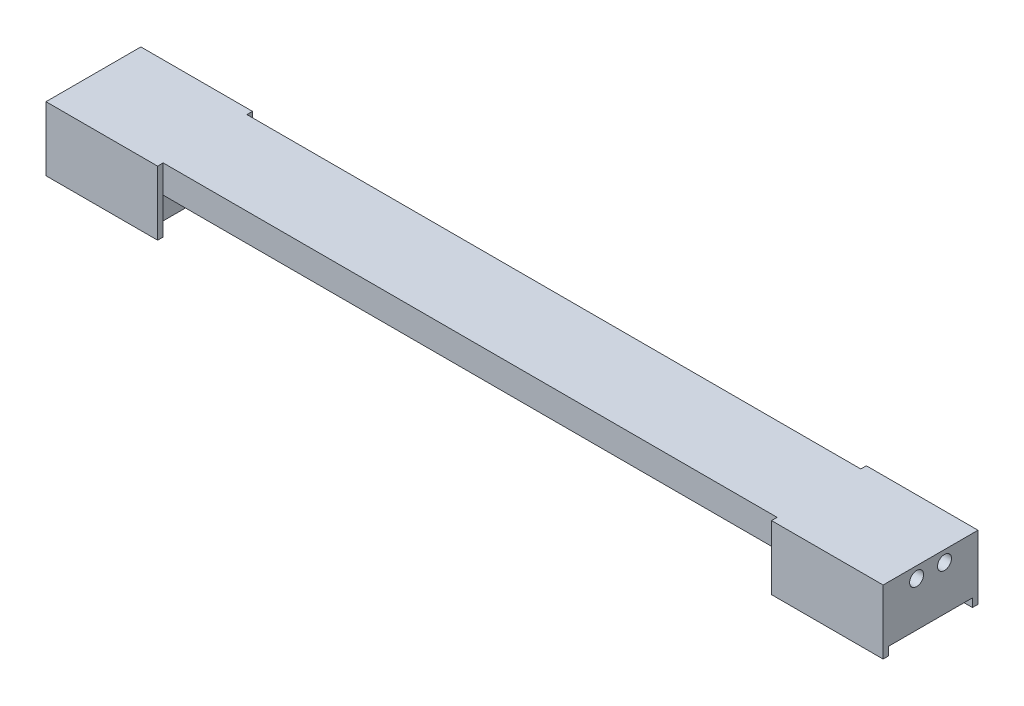
ISO-10303-21;
HEADER;
FILE_DESCRIPTION(('STEP AP214'),'2;1');
FILE_NAME('part.step','',(''),(''),'','','');
FILE_SCHEMA(('AUTOMOTIVE_DESIGN { 1 0 10303 214 1 1 1 1 }'));
ENDSEC;
DATA;
#1=APPLICATION_CONTEXT('core data for automotive mechanical design processes');
#2=APPLICATION_PROTOCOL_DEFINITION('international standard','automotive_design',2000,#1);
#3=PRODUCT_CONTEXT('',#1,'mechanical');
#4=PRODUCT('Part','Part','',(#3));
#5=PRODUCT_RELATED_PRODUCT_CATEGORY('part','',(#4));
#6=PRODUCT_DEFINITION_FORMATION('','',#4);
#7=PRODUCT_DEFINITION_CONTEXT('part definition',#1,'design');
#8=PRODUCT_DEFINITION('design','',#6,#7);
#9=PRODUCT_DEFINITION_SHAPE('','',#8);
#10=(LENGTH_UNIT() NAMED_UNIT(*) SI_UNIT(.MILLI.,.METRE.));
#11=(NAMED_UNIT(*) PLANE_ANGLE_UNIT() SI_UNIT($,.RADIAN.));
#12=(NAMED_UNIT(*) SI_UNIT($,.STERADIAN.) SOLID_ANGLE_UNIT());
#13=UNCERTAINTY_MEASURE_WITH_UNIT(LENGTH_MEASURE(1.E-05),#10,'distance_accuracy_value','');
#14=(GEOMETRIC_REPRESENTATION_CONTEXT(3) GLOBAL_UNCERTAINTY_ASSIGNED_CONTEXT((#13)) GLOBAL_UNIT_ASSIGNED_CONTEXT((#10,
#11,#12)) REPRESENTATION_CONTEXT('',''));
#15=CARTESIAN_POINT('',(0.,0.,0.));
#16=DIRECTION('',(0.,0.,1.));
#17=DIRECTION('',(1.,0.,0.));
#18=AXIS2_PLACEMENT_3D('',#15,#16,#17);
#19=CARTESIAN_POINT('',(0.,-11.5,0.));
#20=DIRECTION('',(0.,-1.,0.));
#21=DIRECTION('',(1.,0.,0.));
#22=AXIS2_PLACEMENT_3D('',#19,#20,#21);
#23=PLANE('',#22);
#24=DIRECTION('',(0.,0.,1.));
#25=VECTOR('',#24,1.);
#26=CARTESIAN_POINT('',(75.,-11.5,-1.));
#27=LINE('',#26,#25);
#28=CARTESIAN_POINT('',(75.,-11.5,-1.));
#29=VERTEX_POINT('',#28);
#30=CARTESIAN_POINT('',(75.,-11.5,0.));
#31=VERTEX_POINT('',#30);
#32=EDGE_CURVE('E294',#29,#31,#27,.T.);
#33=ORIENTED_EDGE('',*,*,#32,.T.);
#34=DIRECTION('',(-1.,0.,0.));
#35=VECTOR('',#34,1.);
#36=CARTESIAN_POINT('',(56.,-11.5,0.));
#37=LINE('',#36,#35);
#38=CARTESIAN_POINT('',(55.,-11.5,0.));
#39=VERTEX_POINT('',#38);
#40=EDGE_CURVE('E270',#31,#39,#37,.T.);
#41=ORIENTED_EDGE('',*,*,#40,.T.);
#42=DIRECTION('',(0.,0.,-1.));
#43=VECTOR('',#42,1.);
#44=CARTESIAN_POINT('',(55.,-11.5,0.));
#45=LINE('',#44,#43);
#46=CARTESIAN_POINT('',(55.,-11.5,-1.));
#47=VERTEX_POINT('',#46);
#48=EDGE_CURVE('E288',#39,#47,#45,.T.);
#49=ORIENTED_EDGE('',*,*,#48,.T.);
#50=DIRECTION('',(1.,0.,0.));
#51=VECTOR('',#50,1.);
#52=CARTESIAN_POINT('',(56.,-11.5,-1.));
#53=LINE('',#52,#51);
#54=EDGE_CURVE('E291',#47,#29,#53,.T.);
#55=ORIENTED_EDGE('',*,*,#54,.T.);
#56=EDGE_LOOP('',(#33,#41,#49,#55));
#57=FACE_BOUND('',#56,.T.);
#58=ADVANCED_FACE('F33',(#57),#23,.T.);
#59=CARTESIAN_POINT('',(0.,-11.5,0.));
#60=DIRECTION('',(0.,-1.,0.));
#61=DIRECTION('',(-1.,0.,0.));
#62=AXIS2_PLACEMENT_3D('',#59,#60,#61);
#63=PLANE('',#62);
#64=DIRECTION('',(1.,0.,0.));
#65=VECTOR('',#64,1.);
#66=CARTESIAN_POINT('',(-56.,-11.5,0.));
#67=LINE('',#66,#65);
#68=CARTESIAN_POINT('',(-75.,-11.5,0.));
#69=VERTEX_POINT('',#68);
#70=CARTESIAN_POINT('',(-55.,-11.5,0.));
#71=VERTEX_POINT('',#70);
#72=EDGE_CURVE('E231',#69,#71,#67,.T.);
#73=ORIENTED_EDGE('',*,*,#72,.F.);
#74=DIRECTION('',(0.,0.,1.));
#75=VECTOR('',#74,1.);
#76=CARTESIAN_POINT('',(-75.,-11.5,-1.));
#77=LINE('',#76,#75);
#78=CARTESIAN_POINT('',(-75.,-11.5,-1.));
#79=VERTEX_POINT('',#78);
#80=EDGE_CURVE('E245',#79,#69,#77,.T.);
#81=ORIENTED_EDGE('',*,*,#80,.F.);
#82=DIRECTION('',(-1.,0.,0.));
#83=VECTOR('',#82,1.);
#84=CARTESIAN_POINT('',(-56.,-11.5,-1.));
#85=LINE('',#84,#83);
#86=CARTESIAN_POINT('',(-55.,-11.5,-1.));
#87=VERTEX_POINT('',#86);
#88=EDGE_CURVE('E248',#87,#79,#85,.T.);
#89=ORIENTED_EDGE('',*,*,#88,.F.);
#90=DIRECTION('',(0.,0.,-1.));
#91=VECTOR('',#90,1.);
#92=CARTESIAN_POINT('',(-55.,-11.5,0.));
#93=LINE('',#92,#91);
#94=EDGE_CURVE('E251',#71,#87,#93,.T.);
#95=ORIENTED_EDGE('',*,*,#94,.F.);
#96=EDGE_LOOP('',(#73,#81,#89,#95));
#97=FACE_BOUND('',#96,.T.);
#98=ADVANCED_FACE('F412',(#97),#63,.T.);
#99=CARTESIAN_POINT('',(0.,0.,15.));
#100=DIRECTION('',(0.,0.,1.));
#101=DIRECTION('',(1.,0.,0.));
#102=AXIS2_PLACEMENT_3D('',#99,#100,#101);
#103=PLANE('',#102);
#104=DIRECTION('',(-1.,0.,0.));
#105=VECTOR('',#104,1.);
#106=CARTESIAN_POINT('',(-74.,0.,15.));
#107=LINE('',#106,#105);
#108=CARTESIAN_POINT('',(55.,0.,15.));
#109=VERTEX_POINT('',#108);
#110=CARTESIAN_POINT('',(-55.,0.,15.));
#111=VERTEX_POINT('',#110);
#112=EDGE_CURVE('E194',#109,#111,#107,.T.);
#113=ORIENTED_EDGE('',*,*,#112,.T.);
#114=DIRECTION('',(0.,-1.,0.));
#115=VECTOR('',#114,1.);
#116=CARTESIAN_POINT('',(-55.,26.2488094968134,15.));
#117=LINE('',#116,#115);
#118=CARTESIAN_POINT('',(-55.,-5.,15.));
#119=VERTEX_POINT('',#118);
#120=EDGE_CURVE('E283',#111,#119,#117,.T.);
#121=ORIENTED_EDGE('',*,*,#120,.T.);
#122=DIRECTION('',(1.,0.,0.));
#123=VECTOR('',#122,1.);
#124=CARTESIAN_POINT('',(-56.,-5.,15.));
#125=LINE('',#124,#123);
#126=CARTESIAN_POINT('',(55.,-5.,15.));
#127=VERTEX_POINT('',#126);
#128=EDGE_CURVE('E340',#119,#127,#125,.T.);
#129=ORIENTED_EDGE('',*,*,#128,.T.);
#130=DIRECTION('',(0.,-1.,0.));
#131=VECTOR('',#130,1.);
#132=CARTESIAN_POINT('',(55.,26.2488094968134,15.));
#133=LINE('',#132,#131);
#134=EDGE_CURVE('E307',#109,#127,#133,.T.);
#135=ORIENTED_EDGE('',*,*,#134,.F.);
#136=EDGE_LOOP('',(#113,#121,#129,#135));
#137=FACE_BOUND('',#136,.T.);
#138=ADVANCED_FACE('F390',(#137),#103,.T.);
#139=CARTESIAN_POINT('',(0.,0.,0.));
#140=DIRECTION('',(0.,0.,1.));
#141=DIRECTION('',(1.,0.,0.));
#142=AXIS2_PLACEMENT_3D('',#139,#140,#141);
#143=PLANE('',#142);
#144=DIRECTION('',(0.,-1.,0.));
#145=VECTOR('',#144,1.);
#146=CARTESIAN_POINT('',(-55.,26.2488094968134,0.));
#147=LINE('',#146,#145);
#148=CARTESIAN_POINT('',(-55.,0.,0.));
#149=VERTEX_POINT('',#148);
#150=CARTESIAN_POINT('',(-55.,-5.,0.));
#151=VERTEX_POINT('',#150);
#152=EDGE_CURVE('E259',#149,#151,#147,.T.);
#153=ORIENTED_EDGE('',*,*,#152,.F.);
#154=DIRECTION('',(-1.,0.,0.));
#155=VECTOR('',#154,1.);
#156=CARTESIAN_POINT('',(-74.,0.,0.));
#157=LINE('',#156,#155);
#158=CARTESIAN_POINT('',(55.,0.,0.));
#159=VERTEX_POINT('',#158);
#160=EDGE_CURVE('E344',#159,#149,#157,.T.);
#161=ORIENTED_EDGE('',*,*,#160,.F.);
#162=DIRECTION('',(0.,-1.,0.));
#163=VECTOR('',#162,1.);
#164=CARTESIAN_POINT('',(55.,26.2488094968134,0.));
#165=LINE('',#164,#163);
#166=CARTESIAN_POINT('',(55.,-5.,0.));
#167=VERTEX_POINT('',#166);
#168=EDGE_CURVE('E56',#159,#167,#165,.T.);
#169=ORIENTED_EDGE('',*,*,#168,.T.);
#170=DIRECTION('',(1.,0.,0.));
#171=VECTOR('',#170,1.);
#172=CARTESIAN_POINT('',(-56.,-5.,0.));
#173=LINE('',#172,#171);
#174=EDGE_CURVE('E356',#151,#167,#173,.T.);
#175=ORIENTED_EDGE('',*,*,#174,.F.);
#176=EDGE_LOOP('',(#153,#161,#169,#175));
#177=FACE_BOUND('',#176,.T.);
#178=ADVANCED_FACE('F422',(#177),#143,.F.);
#179=CARTESIAN_POINT('',(56.,-5.,15.));
#180=DIRECTION('',(1.,0.,0.));
#181=DIRECTION('',(0.,1.,0.));
#182=AXIS2_PLACEMENT_3D('',#179,#180,#181);
#183=PLANE('',#182);
#184=DIRECTION('',(0.,-1.,0.));
#185=VECTOR('',#184,1.);
#186=CARTESIAN_POINT('',(56.,-5.,0.));
#187=LINE('',#186,#185);
#188=CARTESIAN_POINT('',(56.,-5.,0.));
#189=VERTEX_POINT('',#188);
#190=CARTESIAN_POINT('',(56.,-10.,0.));
#191=VERTEX_POINT('',#190);
#192=EDGE_CURVE('E315',#189,#191,#187,.T.);
#193=ORIENTED_EDGE('',*,*,#192,.T.);
#194=DIRECTION('',(0.,0.,-1.));
#195=VECTOR('',#194,1.);
#196=CARTESIAN_POINT('',(56.,-10.,15.));
#197=LINE('',#196,#195);
#198=CARTESIAN_POINT('',(56.,-10.,15.));
#199=VERTEX_POINT('',#198);
#200=EDGE_CURVE('E11',#199,#191,#197,.T.);
#201=ORIENTED_EDGE('',*,*,#200,.F.);
#202=DIRECTION('',(0.,-1.,0.));
#203=VECTOR('',#202,1.);
#204=CARTESIAN_POINT('',(56.,-5.,15.));
#205=LINE('',#204,#203);
#206=CARTESIAN_POINT('',(56.,-5.,15.));
#207=VERTEX_POINT('',#206);
#208=EDGE_CURVE('E191',#207,#199,#205,.T.);
#209=ORIENTED_EDGE('',*,*,#208,.F.);
#210=DIRECTION('',(0.,0.,-1.));
#211=VECTOR('',#210,1.);
#212=CARTESIAN_POINT('',(56.,-5.,15.));
#213=LINE('',#212,#211);
#214=EDGE_CURVE('E339',#207,#189,#213,.T.);
#215=ORIENTED_EDGE('',*,*,#214,.T.);
#216=EDGE_LOOP('',(#193,#201,#209,#215));
#217=FACE_BOUND('',#216,.T.);
#218=ADVANCED_FACE('F35',(#217),#183,.F.);
#219=CARTESIAN_POINT('',(56.,-10.,15.));
#220=DIRECTION('',(0.,1.,0.));
#221=DIRECTION('',(-1.,0.,0.));
#222=AXIS2_PLACEMENT_3D('',#219,#220,#221);
#223=PLANE('',#222);
#224=DIRECTION('',(1.,0.,0.));
#225=VECTOR('',#224,1.);
#226=CARTESIAN_POINT('',(56.,-10.,0.));
#227=LINE('',#226,#225);
#228=CARTESIAN_POINT('',(75.,-9.99999999999998,0.));
#229=VERTEX_POINT('',#228);
#230=EDGE_CURVE('E199',#191,#229,#227,.T.);
#231=ORIENTED_EDGE('',*,*,#230,.T.);
#232=DIRECTION('',(0.,0.,-1.));
#233=VECTOR('',#232,1.);
#234=CARTESIAN_POINT('',(75.,-9.99999999999998,15.));
#235=LINE('',#234,#233);
#236=CARTESIAN_POINT('',(75.,-9.99999999999998,15.));
#237=VERTEX_POINT('',#236);
#238=EDGE_CURVE('E197',#237,#229,#235,.T.);
#239=ORIENTED_EDGE('',*,*,#238,.F.);
#240=DIRECTION('',(1.,0.,0.));
#241=VECTOR('',#240,1.);
#242=CARTESIAN_POINT('',(56.,-10.,15.));
#243=LINE('',#242,#241);
#244=EDGE_CURVE('E184',#199,#237,#243,.T.);
#245=ORIENTED_EDGE('',*,*,#244,.F.);
#246=ORIENTED_EDGE('',*,*,#200,.T.);
#247=EDGE_LOOP('',(#231,#239,#245,#246));
#248=FACE_BOUND('',#247,.T.);
#249=ADVANCED_FACE('F198',(#248),#223,.F.);
#250=CARTESIAN_POINT('',(-74.,0.,15.));
#251=DIRECTION('',(0.,-1.,0.));
#252=DIRECTION('',(1.,0.,0.));
#253=AXIS2_PLACEMENT_3D('',#250,#251,#252);
#254=PLANE('',#253);
#255=DIRECTION('',(0.,0.,1.));
#256=VECTOR('',#255,1.);
#257=CARTESIAN_POINT('',(-55.,0.,15.));
#258=LINE('',#257,#256);
#259=CARTESIAN_POINT('',(-55.,0.,16.));
#260=VERTEX_POINT('',#259);
#261=EDGE_CURVE('E255',#111,#260,#258,.T.);
#262=ORIENTED_EDGE('',*,*,#261,.F.);
#263=ORIENTED_EDGE('',*,*,#112,.F.);
#264=DIRECTION('',(0.,0.,1.));
#265=VECTOR('',#264,1.);
#266=CARTESIAN_POINT('',(55.,0.,15.));
#267=LINE('',#266,#265);
#268=CARTESIAN_POINT('',(55.,0.,16.));
#269=VERTEX_POINT('',#268);
#270=EDGE_CURVE('E313',#109,#269,#267,.T.);
#271=ORIENTED_EDGE('',*,*,#270,.T.);
#272=DIRECTION('',(1.,0.,0.));
#273=VECTOR('',#272,1.);
#274=CARTESIAN_POINT('',(56.,0.,16.));
#275=LINE('',#274,#273);
#276=CARTESIAN_POINT('',(75.,0.,16.));
#277=VERTEX_POINT('',#276);
#278=EDGE_CURVE('E311',#269,#277,#275,.T.);
#279=ORIENTED_EDGE('',*,*,#278,.T.);
#280=DIRECTION('',(0.,0.,-1.));
#281=VECTOR('',#280,1.);
#282=CARTESIAN_POINT('',(75.,0.,-1.));
#283=LINE('',#282,#281);
#284=CARTESIAN_POINT('',(75.,0.,-1.));
#285=VERTEX_POINT('',#284);
#286=EDGE_CURVE('E309',#277,#285,#283,.T.);
#287=ORIENTED_EDGE('',*,*,#286,.T.);
#288=DIRECTION('',(-1.,0.,0.));
#289=VECTOR('',#288,1.);
#290=CARTESIAN_POINT('',(56.,0.,-1.));
#291=LINE('',#290,#289);
#292=CARTESIAN_POINT('',(55.,0.,-1.));
#293=VERTEX_POINT('',#292);
#294=EDGE_CURVE('E306',#285,#293,#291,.T.);
#295=ORIENTED_EDGE('',*,*,#294,.T.);
#296=DIRECTION('',(0.,0.,1.));
#297=VECTOR('',#296,1.);
#298=CARTESIAN_POINT('',(55.,0.,0.));
#299=LINE('',#298,#297);
#300=EDGE_CURVE('E304',#293,#159,#299,.T.);
#301=ORIENTED_EDGE('',*,*,#300,.T.);
#302=ORIENTED_EDGE('',*,*,#160,.T.);
#303=DIRECTION('',(0.,0.,1.));
#304=VECTOR('',#303,1.);
#305=CARTESIAN_POINT('',(-55.,0.,0.));
#306=LINE('',#305,#304);
#307=CARTESIAN_POINT('',(-55.,0.,-1.));
#308=VERTEX_POINT('',#307);
#309=EDGE_CURVE('E268',#308,#149,#306,.T.);
#310=ORIENTED_EDGE('',*,*,#309,.F.);
#311=DIRECTION('',(1.,0.,0.));
#312=VECTOR('',#311,1.);
#313=CARTESIAN_POINT('',(-56.,0.,-1.));
#314=LINE('',#313,#312);
#315=CARTESIAN_POINT('',(-75.,0.,-1.));
#316=VERTEX_POINT('',#315);
#317=EDGE_CURVE('E265',#316,#308,#314,.T.);
#318=ORIENTED_EDGE('',*,*,#317,.F.);
#319=DIRECTION('',(0.,0.,-1.));
#320=VECTOR('',#319,1.);
#321=CARTESIAN_POINT('',(-75.,0.,-1.));
#322=LINE('',#321,#320);
#323=CARTESIAN_POINT('',(-75.,0.,16.));
#324=VERTEX_POINT('',#323);
#325=EDGE_CURVE('E262',#324,#316,#322,.T.);
#326=ORIENTED_EDGE('',*,*,#325,.F.);
#327=DIRECTION('',(-1.,0.,0.));
#328=VECTOR('',#327,1.);
#329=CARTESIAN_POINT('',(-75.,0.,16.));
#330=LINE('',#329,#328);
#331=EDGE_CURVE('E258',#260,#324,#330,.T.);
#332=ORIENTED_EDGE('',*,*,#331,.F.);
#333=EDGE_LOOP('',(#262,#263,#271,#279,#287,#295,#301,#302,#310,#318,#326,#332));
#334=FACE_BOUND('',#333,.T.);
#335=ADVANCED_FACE('F395',(#334),#254,.F.);
#336=CARTESIAN_POINT('',(-56.,-10.,15.));
#337=DIRECTION('',(0.,1.,0.));
#338=DIRECTION('',(-1.,0.,0.));
#339=AXIS2_PLACEMENT_3D('',#336,#337,#338);
#340=PLANE('',#339);
#341=DIRECTION('',(1.,0.,0.));
#342=VECTOR('',#341,1.);
#343=CARTESIAN_POINT('',(-56.,-10.,0.));
#344=LINE('',#343,#342);
#345=CARTESIAN_POINT('',(-75.,-10.,0.));
#346=VERTEX_POINT('',#345);
#347=CARTESIAN_POINT('',(-56.,-10.,0.));
#348=VERTEX_POINT('',#347);
#349=EDGE_CURVE('E347',#346,#348,#344,.T.);
#350=ORIENTED_EDGE('',*,*,#349,.T.);
#351=DIRECTION('',(0.,0.,-1.));
#352=VECTOR('',#351,1.);
#353=CARTESIAN_POINT('',(-56.,-10.,15.));
#354=LINE('',#353,#352);
#355=CARTESIAN_POINT('',(-56.,-10.,15.));
#356=VERTEX_POINT('',#355);
#357=EDGE_CURVE('E41',#356,#348,#354,.T.);
#358=ORIENTED_EDGE('',*,*,#357,.F.);
#359=DIRECTION('',(1.,0.,0.));
#360=VECTOR('',#359,1.);
#361=CARTESIAN_POINT('',(-56.,-10.,15.));
#362=LINE('',#361,#360);
#363=CARTESIAN_POINT('',(-75.,-10.,15.));
#364=VERTEX_POINT('',#363);
#365=EDGE_CURVE('E332',#364,#356,#362,.T.);
#366=ORIENTED_EDGE('',*,*,#365,.F.);
#367=DIRECTION('',(0.,0.,-1.));
#368=VECTOR('',#367,1.);
#369=CARTESIAN_POINT('',(-75.,-10.,15.));
#370=LINE('',#369,#368);
#371=EDGE_CURVE('E212',#364,#346,#370,.T.);
#372=ORIENTED_EDGE('',*,*,#371,.T.);
#373=EDGE_LOOP('',(#350,#358,#366,#372));
#374=FACE_BOUND('',#373,.T.);
#375=ADVANCED_FACE('F368',(#374),#340,.F.);
#376=CARTESIAN_POINT('',(-56.,-5.,15.));
#377=DIRECTION('',(-1.,0.,0.));
#378=DIRECTION('',(0.,-1.,0.));
#379=AXIS2_PLACEMENT_3D('',#376,#377,#378);
#380=PLANE('',#379);
#381=DIRECTION('',(0.,1.,0.));
#382=VECTOR('',#381,1.);
#383=CARTESIAN_POINT('',(-56.,-5.,0.));
#384=LINE('',#383,#382);
#385=CARTESIAN_POINT('',(-56.,-5.,0.));
#386=VERTEX_POINT('',#385);
#387=EDGE_CURVE('E350',#348,#386,#384,.T.);
#388=ORIENTED_EDGE('',*,*,#387,.T.);
#389=DIRECTION('',(0.,0.,-1.));
#390=VECTOR('',#389,1.);
#391=CARTESIAN_POINT('',(-56.,-5.,15.));
#392=LINE('',#391,#390);
#393=CARTESIAN_POINT('',(-56.,-5.,15.));
#394=VERTEX_POINT('',#393);
#395=EDGE_CURVE('E359',#394,#386,#392,.T.);
#396=ORIENTED_EDGE('',*,*,#395,.F.);
#397=DIRECTION('',(0.,1.,0.));
#398=VECTOR('',#397,1.);
#399=CARTESIAN_POINT('',(-56.,-5.,15.));
#400=LINE('',#399,#398);
#401=EDGE_CURVE('E334',#356,#394,#400,.T.);
#402=ORIENTED_EDGE('',*,*,#401,.F.);
#403=ORIENTED_EDGE('',*,*,#357,.T.);
#404=EDGE_LOOP('',(#388,#396,#402,#403));
#405=FACE_BOUND('',#404,.T.);
#406=ADVANCED_FACE('F365',(#405),#380,.F.);
#407=CARTESIAN_POINT('',(-56.,-5.,15.));
#408=DIRECTION('',(0.,1.,0.));
#409=DIRECTION('',(0.,0.,1.));
#410=AXIS2_PLACEMENT_3D('',#407,#408,#409);
#411=PLANE('',#410);
#412=EDGE_CURVE('E328',#386,#151,#173,.T.);
#413=ORIENTED_EDGE('',*,*,#412,.T.);
#414=ORIENTED_EDGE('',*,*,#174,.T.);
#415=EDGE_CURVE('E353',#167,#189,#173,.T.);
#416=ORIENTED_EDGE('',*,*,#415,.T.);
#417=ORIENTED_EDGE('',*,*,#214,.F.);
#418=EDGE_CURVE('E336',#127,#207,#125,.T.);
#419=ORIENTED_EDGE('',*,*,#418,.F.);
#420=ORIENTED_EDGE('',*,*,#128,.F.);
#421=EDGE_CURVE('E337',#394,#119,#125,.T.);
#422=ORIENTED_EDGE('',*,*,#421,.F.);
#423=ORIENTED_EDGE('',*,*,#395,.T.);
#424=EDGE_LOOP('',(#413,#414,#416,#417,#419,#420,#422,#423));
#425=FACE_BOUND('',#424,.T.);
#426=ADVANCED_FACE('F374',(#425),#411,.F.);
#427=CARTESIAN_POINT('',(74.,26.2488094968134,15.));
#428=DIRECTION('',(0.,0.,-1.));
#429=DIRECTION('',(-1.,0.,0.));
#430=AXIS2_PLACEMENT_3D('',#427,#428,#429);
#431=PLANE('',#430);
#432=ORIENTED_EDGE('',*,*,#208,.T.);
#433=ORIENTED_EDGE('',*,*,#244,.T.);
#434=DIRECTION('',(0.,1.,0.));
#435=VECTOR('',#434,1.);
#436=CARTESIAN_POINT('',(75.,-11.5,15.));
#437=LINE('',#436,#435);
#438=CARTESIAN_POINT('',(75.,-11.5,15.));
#439=VERTEX_POINT('',#438);
#440=EDGE_CURVE('E188',#439,#237,#437,.T.);
#441=ORIENTED_EDGE('',*,*,#440,.F.);
#442=DIRECTION('',(1.,0.,0.));
#443=VECTOR('',#442,1.);
#444=CARTESIAN_POINT('',(56.,-11.5,15.));
#445=LINE('',#444,#443);
#446=CARTESIAN_POINT('',(55.,-11.5,15.));
#447=VERTEX_POINT('',#446);
#448=EDGE_CURVE('E48',#447,#439,#445,.T.);
#449=ORIENTED_EDGE('',*,*,#448,.F.);
#450=EDGE_CURVE('E318',#127,#447,#133,.T.);
#451=ORIENTED_EDGE('',*,*,#450,.F.);
#452=ORIENTED_EDGE('',*,*,#418,.T.);
#453=EDGE_LOOP('',(#432,#433,#441,#449,#451,#452));
#454=FACE_BOUND('',#453,.T.);
#455=ADVANCED_FACE('F186',(#454),#431,.T.);
#456=CARTESIAN_POINT('',(56.,26.2488094968134,0.));
#457=DIRECTION('',(0.,0.,1.));
#458=DIRECTION('',(1.,0.,0.));
#459=AXIS2_PLACEMENT_3D('',#456,#457,#458);
#460=PLANE('',#459);
#461=EDGE_CURVE('E303',#167,#39,#165,.T.);
#462=ORIENTED_EDGE('',*,*,#461,.T.);
#463=ORIENTED_EDGE('',*,*,#40,.F.);
#464=DIRECTION('',(0.,-1.,0.));
#465=VECTOR('',#464,1.);
#466=CARTESIAN_POINT('',(75.,-9.99999999999998,0.));
#467=LINE('',#466,#465);
#468=EDGE_CURVE('E203',#229,#31,#467,.T.);
#469=ORIENTED_EDGE('',*,*,#468,.F.);
#470=ORIENTED_EDGE('',*,*,#230,.F.);
#471=ORIENTED_EDGE('',*,*,#192,.F.);
#472=ORIENTED_EDGE('',*,*,#415,.F.);
#473=EDGE_LOOP('',(#462,#463,#469,#470,#471,#472));
#474=FACE_BOUND('',#473,.T.);
#475=ADVANCED_FACE('F426',(#474),#460,.T.);
#476=CARTESIAN_POINT('',(55.,26.2488094968134,15.));
#477=DIRECTION('',(-1.,0.,0.));
#478=DIRECTION('',(0.,-1.,0.));
#479=AXIS2_PLACEMENT_3D('',#476,#477,#478);
#480=PLANE('',#479);
#481=ORIENTED_EDGE('',*,*,#270,.F.);
#482=ORIENTED_EDGE('',*,*,#134,.T.);
#483=ORIENTED_EDGE('',*,*,#450,.T.);
#484=DIRECTION('',(0.,0.,-1.));
#485=VECTOR('',#484,1.);
#486=CARTESIAN_POINT('',(55.,-11.5,15.));
#487=LINE('',#486,#485);
#488=CARTESIAN_POINT('',(55.,-11.5,16.));
#489=VERTEX_POINT('',#488);
#490=EDGE_CURVE('E300',#489,#447,#487,.T.);
#491=ORIENTED_EDGE('',*,*,#490,.F.);
#492=DIRECTION('',(0.,-1.,0.));
#493=VECTOR('',#492,1.);
#494=CARTESIAN_POINT('',(55.,26.2488094968134,16.));
#495=LINE('',#494,#493);
#496=EDGE_CURVE('E319',#269,#489,#495,.T.);
#497=ORIENTED_EDGE('',*,*,#496,.F.);
#498=EDGE_LOOP('',(#481,#482,#483,#491,#497));
#499=FACE_BOUND('',#498,.T.);
#500=ADVANCED_FACE('F445',(#499),#480,.T.);
#501=CARTESIAN_POINT('',(56.,26.2488094968134,16.));
#502=DIRECTION('',(0.,0.,1.));
#503=DIRECTION('',(1.,0.,0.));
#504=AXIS2_PLACEMENT_3D('',#501,#502,#503);
#505=PLANE('',#504);
#506=ORIENTED_EDGE('',*,*,#278,.F.);
#507=ORIENTED_EDGE('',*,*,#496,.T.);
#508=DIRECTION('',(-1.,0.,0.));
#509=VECTOR('',#508,1.);
#510=CARTESIAN_POINT('',(75.,-11.5,16.));
#511=LINE('',#510,#509);
#512=CARTESIAN_POINT('',(75.,-11.5,16.));
#513=VERTEX_POINT('',#512);
#514=EDGE_CURVE('E297',#513,#489,#511,.T.);
#515=ORIENTED_EDGE('',*,*,#514,.F.);
#516=DIRECTION('',(0.,-1.,0.));
#517=VECTOR('',#516,1.);
#518=CARTESIAN_POINT('',(75.,26.2488094968134,16.));
#519=LINE('',#518,#517);
#520=EDGE_CURVE('E321',#277,#513,#519,.T.);
#521=ORIENTED_EDGE('',*,*,#520,.F.);
#522=EDGE_LOOP('',(#506,#507,#515,#521));
#523=FACE_BOUND('',#522,.T.);
#524=ADVANCED_FACE('F440',(#523),#505,.T.);
#525=CARTESIAN_POINT('',(75.,26.2488094968134,-1.));
#526=DIRECTION('',(1.,0.,0.));
#527=DIRECTION('',(0.,1.,0.));
#528=AXIS2_PLACEMENT_3D('',#525,#526,#527);
#529=PLANE('',#528);
#530=ORIENTED_EDGE('',*,*,#468,.T.);
#531=ORIENTED_EDGE('',*,*,#32,.F.);
#532=DIRECTION('',(0.,-1.,0.));
#533=VECTOR('',#532,1.);
#534=CARTESIAN_POINT('',(75.,26.2488094968134,-1.));
#535=LINE('',#534,#533);
#536=EDGE_CURVE('E323',#285,#29,#535,.T.);
#537=ORIENTED_EDGE('',*,*,#536,.F.);
#538=ORIENTED_EDGE('',*,*,#286,.F.);
#539=ORIENTED_EDGE('',*,*,#520,.T.);
#540=EDGE_CURVE('E208',#439,#513,#27,.T.);
#541=ORIENTED_EDGE('',*,*,#540,.F.);
#542=ORIENTED_EDGE('',*,*,#440,.T.);
#543=ORIENTED_EDGE('',*,*,#238,.T.);
#544=EDGE_LOOP('',(#530,#531,#537,#538,#539,#541,#542,#543));
#545=FACE_BOUND('',#544,.T.);
#546=CARTESIAN_POINT('',(75.,-1.99999999999999,5.));
#547=DIRECTION('',(-1.,0.,0.));
#548=DIRECTION('',(0.,1.,0.));
#549=AXIS2_PLACEMENT_3D('',#546,#547,#548);
#550=CIRCLE('',#549,1.25);
#551=CARTESIAN_POINT('',(75.,-0.749999999999986,5.));
#552=VERTEX_POINT('',#551);
#553=EDGE_CURVE('E222',#552,#552,#550,.T.);
#554=ORIENTED_EDGE('',*,*,#553,.T.);
#555=EDGE_LOOP('',(#554));
#556=FACE_BOUND('',#555,.T.);
#557=CARTESIAN_POINT('',(75.,-1.99999999999999,10.));
#558=DIRECTION('',(-1.,0.,0.));
#559=DIRECTION('',(0.,-1.,0.));
#560=AXIS2_PLACEMENT_3D('',#557,#558,#559);
#561=CIRCLE('',#560,1.25);
#562=CARTESIAN_POINT('',(75.,-3.24999999999998,10.));
#563=VERTEX_POINT('',#562);
#564=EDGE_CURVE('E228',#563,#563,#561,.T.);
#565=ORIENTED_EDGE('',*,*,#564,.T.);
#566=EDGE_LOOP('',(#565));
#567=FACE_BOUND('',#566,.T.);
#568=ADVANCED_FACE('F205',(#545,#556,#567),#529,.T.);
#569=CARTESIAN_POINT('',(56.,26.2488094968134,-1.));
#570=DIRECTION('',(0.,0.,-1.));
#571=DIRECTION('',(-1.,0.,0.));
#572=AXIS2_PLACEMENT_3D('',#569,#570,#571);
#573=PLANE('',#572);
#574=ORIENTED_EDGE('',*,*,#294,.F.);
#575=ORIENTED_EDGE('',*,*,#536,.T.);
#576=ORIENTED_EDGE('',*,*,#54,.F.);
#577=DIRECTION('',(0.,-1.,0.));
#578=VECTOR('',#577,1.);
#579=CARTESIAN_POINT('',(55.,26.2488094968134,-1.));
#580=LINE('',#579,#578);
#581=EDGE_CURVE('E325',#293,#47,#580,.T.);
#582=ORIENTED_EDGE('',*,*,#581,.F.);
#583=EDGE_LOOP('',(#574,#575,#576,#582));
#584=FACE_BOUND('',#583,.T.);
#585=ADVANCED_FACE('F435',(#584),#573,.T.);
#586=CARTESIAN_POINT('',(55.,26.2488094968134,0.));
#587=DIRECTION('',(-1.,0.,0.));
#588=DIRECTION('',(0.,-1.,0.));
#589=AXIS2_PLACEMENT_3D('',#586,#587,#588);
#590=PLANE('',#589);
#591=ORIENTED_EDGE('',*,*,#300,.F.);
#592=ORIENTED_EDGE('',*,*,#581,.T.);
#593=ORIENTED_EDGE('',*,*,#48,.F.);
#594=ORIENTED_EDGE('',*,*,#461,.F.);
#595=ORIENTED_EDGE('',*,*,#168,.F.);
#596=EDGE_LOOP('',(#591,#592,#593,#594,#595));
#597=FACE_BOUND('',#596,.T.);
#598=ADVANCED_FACE('F466',(#597),#590,.T.);
#599=ORIENTED_EDGE('',*,*,#448,.T.);
#600=ORIENTED_EDGE('',*,*,#540,.T.);
#601=ORIENTED_EDGE('',*,*,#514,.T.);
#602=ORIENTED_EDGE('',*,*,#490,.T.);
#603=EDGE_LOOP('',(#599,#600,#601,#602));
#604=FACE_BOUND('',#603,.T.);
#605=ADVANCED_FACE('F443',(#604),#23,.T.);
#606=CARTESIAN_POINT('',(-56.,26.2488094968134,15.));
#607=DIRECTION('',(0.,0.,1.));
#608=DIRECTION('',(1.,0.,0.));
#609=AXIS2_PLACEMENT_3D('',#606,#607,#608);
#610=PLANE('',#609);
#611=CARTESIAN_POINT('',(-55.,-11.5,15.));
#612=VERTEX_POINT('',#611);
#613=EDGE_CURVE('E254',#119,#612,#117,.T.);
#614=ORIENTED_EDGE('',*,*,#613,.T.);
#615=DIRECTION('',(-1.,0.,0.));
#616=VECTOR('',#615,1.);
#617=CARTESIAN_POINT('',(-74.,-11.5,15.));
#618=LINE('',#617,#616);
#619=CARTESIAN_POINT('',(-75.,-11.5,15.));
#620=VERTEX_POINT('',#619);
#621=EDGE_CURVE('E236',#612,#620,#618,.T.);
#622=ORIENTED_EDGE('',*,*,#621,.T.);
#623=DIRECTION('',(0.,1.,0.));
#624=VECTOR('',#623,1.);
#625=CARTESIAN_POINT('',(-75.,-11.5,15.));
#626=LINE('',#625,#624);
#627=EDGE_CURVE('E217',#620,#364,#626,.T.);
#628=ORIENTED_EDGE('',*,*,#627,.T.);
#629=ORIENTED_EDGE('',*,*,#365,.T.);
#630=ORIENTED_EDGE('',*,*,#401,.T.);
#631=ORIENTED_EDGE('',*,*,#421,.T.);
#632=EDGE_LOOP('',(#614,#622,#628,#629,#630,#631));
#633=FACE_BOUND('',#632,.T.);
#634=ADVANCED_FACE('F383',(#633),#610,.F.);
#635=CARTESIAN_POINT('',(-56.,26.2488094968134,0.));
#636=DIRECTION('',(0.,0.,-1.));
#637=DIRECTION('',(-1.,0.,0.));
#638=AXIS2_PLACEMENT_3D('',#635,#636,#637);
#639=PLANE('',#638);
#640=ORIENTED_EDGE('',*,*,#387,.F.);
#641=ORIENTED_EDGE('',*,*,#349,.F.);
#642=DIRECTION('',(0.,-1.,0.));
#643=VECTOR('',#642,1.);
#644=CARTESIAN_POINT('',(-75.,-10.,0.));
#645=LINE('',#644,#643);
#646=EDGE_CURVE('E209',#346,#69,#645,.T.);
#647=ORIENTED_EDGE('',*,*,#646,.T.);
#648=ORIENTED_EDGE('',*,*,#72,.T.);
#649=EDGE_CURVE('E273',#151,#71,#147,.T.);
#650=ORIENTED_EDGE('',*,*,#649,.F.);
#651=ORIENTED_EDGE('',*,*,#412,.F.);
#652=EDGE_LOOP('',(#640,#641,#647,#648,#650,#651));
#653=FACE_BOUND('',#652,.T.);
#654=ADVANCED_FACE('F372',(#653),#639,.F.);
#655=CARTESIAN_POINT('',(-55.,26.2488094968134,15.));
#656=DIRECTION('',(-1.,0.,0.));
#657=DIRECTION('',(0.,-1.,0.));
#658=AXIS2_PLACEMENT_3D('',#655,#656,#657);
#659=PLANE('',#658);
#660=ORIENTED_EDGE('',*,*,#120,.F.);
#661=ORIENTED_EDGE('',*,*,#261,.T.);
#662=DIRECTION('',(0.,-1.,0.));
#663=VECTOR('',#662,1.);
#664=CARTESIAN_POINT('',(-55.,26.2488094968134,16.));
#665=LINE('',#664,#663);
#666=CARTESIAN_POINT('',(-55.,-11.5,16.));
#667=VERTEX_POINT('',#666);
#668=EDGE_CURVE('E281',#260,#667,#665,.T.);
#669=ORIENTED_EDGE('',*,*,#668,.T.);
#670=DIRECTION('',(0.,0.,-1.));
#671=VECTOR('',#670,1.);
#672=CARTESIAN_POINT('',(-55.,-11.5,15.));
#673=LINE('',#672,#671);
#674=EDGE_CURVE('E238',#667,#612,#673,.T.);
#675=ORIENTED_EDGE('',*,*,#674,.T.);
#676=ORIENTED_EDGE('',*,*,#613,.F.);
#677=EDGE_LOOP('',(#660,#661,#669,#675,#676));
#678=FACE_BOUND('',#677,.T.);
#679=ADVANCED_FACE('F387',(#678),#659,.F.);
#680=CARTESIAN_POINT('',(-75.,26.2488094968134,16.));
#681=DIRECTION('',(0.,0.,-1.));
#682=DIRECTION('',(-1.,0.,0.));
#683=AXIS2_PLACEMENT_3D('',#680,#681,#682);
#684=PLANE('',#683);
#685=ORIENTED_EDGE('',*,*,#668,.F.);
#686=ORIENTED_EDGE('',*,*,#331,.T.);
#687=DIRECTION('',(0.,-1.,0.));
#688=VECTOR('',#687,1.);
#689=CARTESIAN_POINT('',(-75.,26.2488094968134,16.));
#690=LINE('',#689,#688);
#691=CARTESIAN_POINT('',(-75.,-11.5,16.));
#692=VERTEX_POINT('',#691);
#693=EDGE_CURVE('E278',#324,#692,#690,.T.);
#694=ORIENTED_EDGE('',*,*,#693,.T.);
#695=DIRECTION('',(1.,0.,0.));
#696=VECTOR('',#695,1.);
#697=CARTESIAN_POINT('',(-56.,-11.5,16.));
#698=LINE('',#697,#696);
#699=EDGE_CURVE('E241',#692,#667,#698,.T.);
#700=ORIENTED_EDGE('',*,*,#699,.T.);
#701=EDGE_LOOP('',(#685,#686,#694,#700));
#702=FACE_BOUND('',#701,.T.);
#703=ADVANCED_FACE('F403',(#702),#684,.F.);
#704=CARTESIAN_POINT('',(-75.,26.2488094968134,-1.));
#705=DIRECTION('',(1.,0.,0.));
#706=DIRECTION('',(0.,1.,0.));
#707=AXIS2_PLACEMENT_3D('',#704,#705,#706);
#708=PLANE('',#707);
#709=CARTESIAN_POINT('',(-75.,-2.00000000000001,5.));
#710=DIRECTION('',(-1.,0.,0.));
#711=DIRECTION('',(0.,1.,0.));
#712=AXIS2_PLACEMENT_3D('',#709,#710,#711);
#713=CIRCLE('',#712,1.25);
#714=CARTESIAN_POINT('',(-75.,-0.750000000000015,5.));
#715=VERTEX_POINT('',#714);
#716=EDGE_CURVE('E216',#715,#715,#713,.T.);
#717=ORIENTED_EDGE('',*,*,#716,.F.);
#718=EDGE_LOOP('',(#717));
#719=FACE_BOUND('',#718,.T.);
#720=CARTESIAN_POINT('',(-75.,-2.00000000000001,10.));
#721=DIRECTION('',(-1.,0.,0.));
#722=DIRECTION('',(0.,-1.,0.));
#723=AXIS2_PLACEMENT_3D('',#720,#721,#722);
#724=CIRCLE('',#723,1.25);
#725=CARTESIAN_POINT('',(-75.,-3.25000000000001,10.));
#726=VERTEX_POINT('',#725);
#727=EDGE_CURVE('E225',#726,#726,#724,.T.);
#728=ORIENTED_EDGE('',*,*,#727,.F.);
#729=EDGE_LOOP('',(#728));
#730=FACE_BOUND('',#729,.T.);
#731=ORIENTED_EDGE('',*,*,#80,.T.);
#732=ORIENTED_EDGE('',*,*,#646,.F.);
#733=ORIENTED_EDGE('',*,*,#371,.F.);
#734=ORIENTED_EDGE('',*,*,#627,.F.);
#735=EDGE_CURVE('E244',#620,#692,#77,.T.);
#736=ORIENTED_EDGE('',*,*,#735,.T.);
#737=ORIENTED_EDGE('',*,*,#693,.F.);
#738=ORIENTED_EDGE('',*,*,#325,.T.);
#739=DIRECTION('',(0.,-1.,0.));
#740=VECTOR('',#739,1.);
#741=CARTESIAN_POINT('',(-75.,26.2488094968134,-1.));
#742=LINE('',#741,#740);
#743=EDGE_CURVE('E276',#316,#79,#742,.T.);
#744=ORIENTED_EDGE('',*,*,#743,.T.);
#745=EDGE_LOOP('',(#731,#732,#733,#734,#736,#737,#738,#744));
#746=FACE_BOUND('',#745,.T.);
#747=ADVANCED_FACE('F406',(#719,#730,#746),#708,.F.);
#748=CARTESIAN_POINT('',(-56.,26.2488094968134,-1.));
#749=DIRECTION('',(0.,0.,1.));
#750=DIRECTION('',(1.,0.,0.));
#751=AXIS2_PLACEMENT_3D('',#748,#749,#750);
#752=PLANE('',#751);
#753=ORIENTED_EDGE('',*,*,#743,.F.);
#754=ORIENTED_EDGE('',*,*,#317,.T.);
#755=DIRECTION('',(0.,-1.,0.));
#756=VECTOR('',#755,1.);
#757=CARTESIAN_POINT('',(-55.,26.2488094968134,-1.));
#758=LINE('',#757,#756);
#759=EDGE_CURVE('E274',#308,#87,#758,.T.);
#760=ORIENTED_EDGE('',*,*,#759,.T.);
#761=ORIENTED_EDGE('',*,*,#88,.T.);
#762=EDGE_LOOP('',(#753,#754,#760,#761));
#763=FACE_BOUND('',#762,.T.);
#764=ADVANCED_FACE('F415',(#763),#752,.F.);
#765=CARTESIAN_POINT('',(-55.,26.2488094968134,0.));
#766=DIRECTION('',(-1.,0.,0.));
#767=DIRECTION('',(0.,-1.,0.));
#768=AXIS2_PLACEMENT_3D('',#765,#766,#767);
#769=PLANE('',#768);
#770=ORIENTED_EDGE('',*,*,#759,.F.);
#771=ORIENTED_EDGE('',*,*,#309,.T.);
#772=ORIENTED_EDGE('',*,*,#152,.T.);
#773=ORIENTED_EDGE('',*,*,#649,.T.);
#774=ORIENTED_EDGE('',*,*,#94,.T.);
#775=EDGE_LOOP('',(#770,#771,#772,#773,#774));
#776=FACE_BOUND('',#775,.T.);
#777=ADVANCED_FACE('F418',(#776),#769,.F.);
#778=ORIENTED_EDGE('',*,*,#735,.F.);
#779=ORIENTED_EDGE('',*,*,#621,.F.);
#780=ORIENTED_EDGE('',*,*,#674,.F.);
#781=ORIENTED_EDGE('',*,*,#699,.F.);
#782=EDGE_LOOP('',(#778,#779,#780,#781));
#783=FACE_BOUND('',#782,.T.);
#784=ADVANCED_FACE('F402',(#783),#63,.T.);
#785=CARTESIAN_POINT('',(75.,-1.99999999999999,10.));
#786=DIRECTION('',(-1.,0.,0.));
#787=DIRECTION('',(0.,-1.,0.));
#788=AXIS2_PLACEMENT_3D('',#785,#786,#787);
#789=CYLINDRICAL_SURFACE('',#788,1.25);
#790=ORIENTED_EDGE('',*,*,#564,.F.);
#791=EDGE_LOOP('',(#790));
#792=FACE_BOUND('',#791,.T.);
#793=ORIENTED_EDGE('',*,*,#727,.T.);
#794=EDGE_LOOP('',(#793));
#795=FACE_BOUND('',#794,.T.);
#796=ADVANCED_FACE('F589',(#792,#795),#789,.F.);
#797=CARTESIAN_POINT('',(75.,-1.99999999999999,5.));
#798=DIRECTION('',(-1.,0.,0.));
#799=DIRECTION('',(0.,-1.,0.));
#800=AXIS2_PLACEMENT_3D('',#797,#798,#799);
#801=CYLINDRICAL_SURFACE('',#800,1.25);
#802=ORIENTED_EDGE('',*,*,#553,.F.);
#803=EDGE_LOOP('',(#802));
#804=FACE_BOUND('',#803,.T.);
#805=ORIENTED_EDGE('',*,*,#716,.T.);
#806=EDGE_LOOP('',(#805));
#807=FACE_BOUND('',#806,.T.);
#808=ADVANCED_FACE('F656',(#804,#807),#801,.F.);
#809=CLOSED_SHELL('',(#58,#98,#138,#178,#218,#249,#335,#375,#406,#426,#455,#475,#500,#524,#568,
#585,#598,#605,#634,#654,#679,#703,#747,#764,#777,#784,#796,#808));
#810=MANIFOLD_SOLID_BREP('B2',#809);
#811=ADVANCED_BREP_SHAPE_REPRESENTATION('',(#18,#810),#14);
#812=SHAPE_DEFINITION_REPRESENTATION(#9,#811);
ENDSEC;
END-ISO-10303-21;
